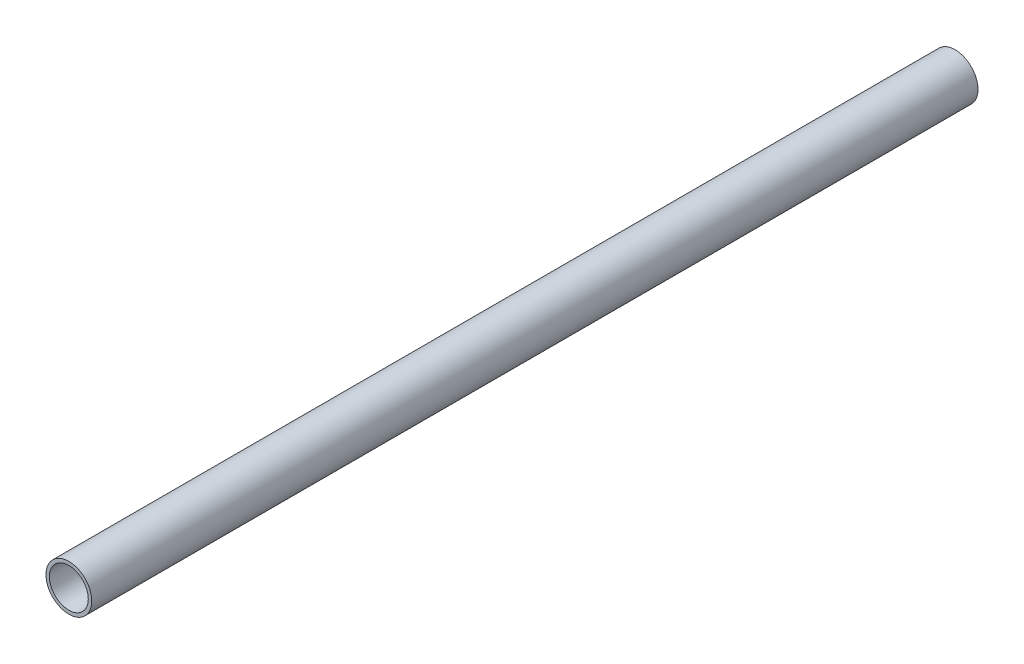
ISO-10303-21;
HEADER;
FILE_DESCRIPTION(('STEP AP214'),'2;1');
FILE_NAME('part.step','',(''),(''),'','','');
FILE_SCHEMA(('AUTOMOTIVE_DESIGN { 1 0 10303 214 1 1 1 1 }'));
ENDSEC;
DATA;
#1=APPLICATION_CONTEXT('core data for automotive mechanical design processes');
#2=APPLICATION_PROTOCOL_DEFINITION('international standard','automotive_design',2000,#1);
#3=PRODUCT_CONTEXT('',#1,'mechanical');
#4=PRODUCT('Part','Part','',(#3));
#5=PRODUCT_RELATED_PRODUCT_CATEGORY('part','',(#4));
#6=PRODUCT_DEFINITION_FORMATION('','',#4);
#7=PRODUCT_DEFINITION_CONTEXT('part definition',#1,'design');
#8=PRODUCT_DEFINITION('design','',#6,#7);
#9=PRODUCT_DEFINITION_SHAPE('','',#8);
#10=(LENGTH_UNIT() NAMED_UNIT(*) SI_UNIT(.MILLI.,.METRE.));
#11=(NAMED_UNIT(*) PLANE_ANGLE_UNIT() SI_UNIT($,.RADIAN.));
#12=(NAMED_UNIT(*) SI_UNIT($,.STERADIAN.) SOLID_ANGLE_UNIT());
#13=UNCERTAINTY_MEASURE_WITH_UNIT(LENGTH_MEASURE(1.E-05),#10,'distance_accuracy_value','');
#14=(GEOMETRIC_REPRESENTATION_CONTEXT(3) GLOBAL_UNCERTAINTY_ASSIGNED_CONTEXT((#13)) GLOBAL_UNIT_ASSIGNED_CONTEXT((#10,
#11,#12)) REPRESENTATION_CONTEXT('',''));
#15=CARTESIAN_POINT('',(0.,0.,0.));
#16=DIRECTION('',(0.,0.,1.));
#17=DIRECTION('',(1.,0.,0.));
#18=AXIS2_PLACEMENT_3D('',#15,#16,#17);
#19=CARTESIAN_POINT('',(0.,0.,115.));
#20=DIRECTION('',(0.,0.,-1.));
#21=DIRECTION('',(-1.,0.,0.));
#22=AXIS2_PLACEMENT_3D('',#19,#20,#21);
#23=CYLINDRICAL_SURFACE('',#22,2.97);
#24=CARTESIAN_POINT('',(0.,0.,115.));
#25=DIRECTION('',(0.,0.,1.));
#26=DIRECTION('',(1.,0.,0.));
#27=AXIS2_PLACEMENT_3D('',#24,#25,#26);
#28=CIRCLE('',#27,2.97);
#29=CARTESIAN_POINT('',(2.97,0.,115.));
#30=VERTEX_POINT('',#29);
#31=EDGE_CURVE('E10',#30,#30,#28,.T.);
#32=ORIENTED_EDGE('',*,*,#31,.F.);
#33=EDGE_LOOP('',(#32));
#34=FACE_BOUND('',#33,.T.);
#35=CARTESIAN_POINT('',(0.,0.,0.));
#36=DIRECTION('',(0.,0.,1.));
#37=DIRECTION('',(1.,0.,0.));
#38=AXIS2_PLACEMENT_3D('',#35,#36,#37);
#39=CIRCLE('',#38,2.97);
#40=CARTESIAN_POINT('',(2.97,0.,0.));
#41=VERTEX_POINT('',#40);
#42=EDGE_CURVE('E40',#41,#41,#39,.T.);
#43=ORIENTED_EDGE('',*,*,#42,.T.);
#44=EDGE_LOOP('',(#43));
#45=FACE_BOUND('',#44,.T.);
#46=ADVANCED_FACE('F37',(#34,#45),#23,.T.);
#47=CARTESIAN_POINT('',(0.,0.,115.));
#48=DIRECTION('',(0.,0.,1.));
#49=DIRECTION('',(1.,0.,0.));
#50=AXIS2_PLACEMENT_3D('',#47,#48,#49);
#51=PLANE('',#50);
#52=CARTESIAN_POINT('',(0.,0.,115.));
#53=DIRECTION('',(0.,0.,1.));
#54=DIRECTION('',(1.,0.,0.));
#55=AXIS2_PLACEMENT_3D('',#52,#53,#54);
#56=CIRCLE('',#55,2.52);
#57=CARTESIAN_POINT('',(2.52,0.,115.));
#58=VERTEX_POINT('',#57);
#59=EDGE_CURVE('E51',#58,#58,#56,.T.);
#60=ORIENTED_EDGE('',*,*,#59,.F.);
#61=EDGE_LOOP('',(#60));
#62=FACE_BOUND('',#61,.T.);
#63=ORIENTED_EDGE('',*,*,#31,.T.);
#64=EDGE_LOOP('',(#63));
#65=FACE_BOUND('',#64,.T.);
#66=ADVANCED_FACE('F68',(#62,#65),#51,.T.);
#67=CARTESIAN_POINT('',(0.,0.,0.));
#68=DIRECTION('',(0.,0.,1.));
#69=DIRECTION('',(1.,0.,0.));
#70=AXIS2_PLACEMENT_3D('',#67,#68,#69);
#71=PLANE('',#70);
#72=CARTESIAN_POINT('',(0.,0.,0.));
#73=DIRECTION('',(0.,0.,1.));
#74=DIRECTION('',(1.,0.,0.));
#75=AXIS2_PLACEMENT_3D('',#72,#73,#74);
#76=CIRCLE('',#75,2.52);
#77=CARTESIAN_POINT('',(2.52,0.,0.));
#78=VERTEX_POINT('',#77);
#79=EDGE_CURVE('E49',#78,#78,#76,.T.);
#80=ORIENTED_EDGE('',*,*,#79,.T.);
#81=EDGE_LOOP('',(#80));
#82=FACE_BOUND('',#81,.T.);
#83=ORIENTED_EDGE('',*,*,#42,.F.);
#84=EDGE_LOOP('',(#83));
#85=FACE_BOUND('',#84,.T.);
#86=ADVANCED_FACE('F59',(#82,#85),#71,.F.);
#87=CARTESIAN_POINT('',(0.,0.,0.));
#88=DIRECTION('',(0.,0.,1.));
#89=DIRECTION('',(1.,0.,0.));
#90=AXIS2_PLACEMENT_3D('',#87,#88,#89);
#91=CYLINDRICAL_SURFACE('',#90,2.52);
#92=ORIENTED_EDGE('',*,*,#79,.F.);
#93=EDGE_LOOP('',(#92));
#94=FACE_BOUND('',#93,.T.);
#95=ORIENTED_EDGE('',*,*,#59,.T.);
#96=EDGE_LOOP('',(#95));
#97=FACE_BOUND('',#96,.T.);
#98=ADVANCED_FACE('F62',(#94,#97),#91,.F.);
#99=CLOSED_SHELL('',(#46,#66,#86,#98));
#100=MANIFOLD_SOLID_BREP('B2',#99);
#101=ADVANCED_BREP_SHAPE_REPRESENTATION('',(#18,#100),#14);
#102=SHAPE_DEFINITION_REPRESENTATION(#9,#101);
ENDSEC;
END-ISO-10303-21;
